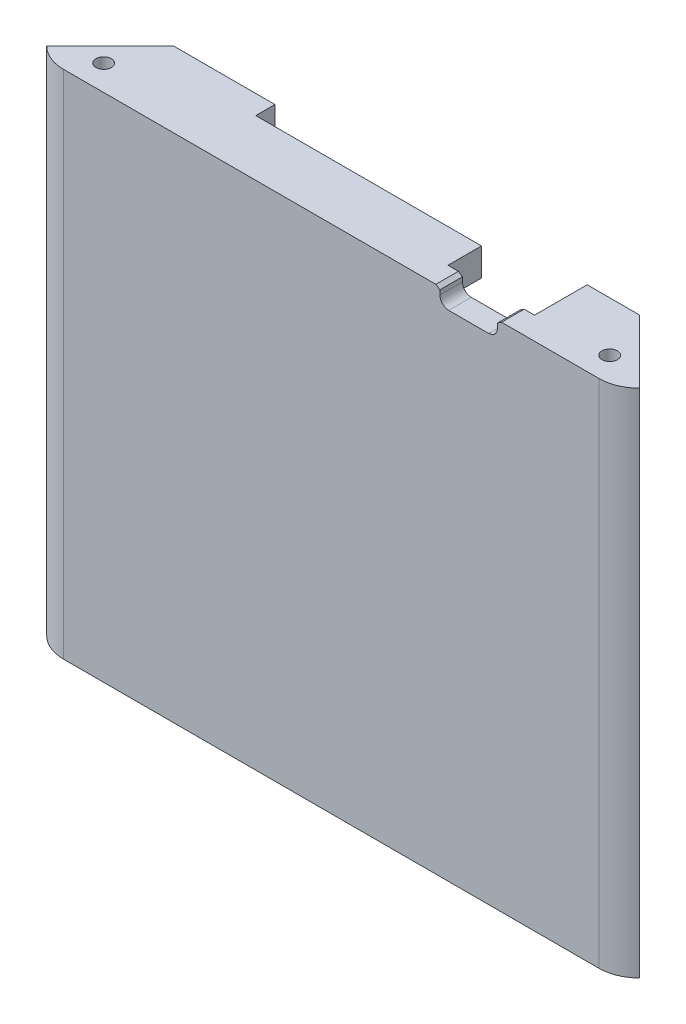
ISO-10303-21;
HEADER;
FILE_DESCRIPTION(('STEP AP214'),'2;1');
FILE_NAME('part.step','',(''),(''),'','','');
FILE_SCHEMA(('AUTOMOTIVE_DESIGN { 1 0 10303 214 1 1 1 1 }'));
ENDSEC;
DATA;
#1=APPLICATION_CONTEXT('core data for automotive mechanical design processes');
#2=APPLICATION_PROTOCOL_DEFINITION('international standard','automotive_design',2000,#1);
#3=PRODUCT_CONTEXT('',#1,'mechanical');
#4=PRODUCT('Part','Part','',(#3));
#5=PRODUCT_RELATED_PRODUCT_CATEGORY('part','',(#4));
#6=PRODUCT_DEFINITION_FORMATION('','',#4);
#7=PRODUCT_DEFINITION_CONTEXT('part definition',#1,'design');
#8=PRODUCT_DEFINITION('design','',#6,#7);
#9=PRODUCT_DEFINITION_SHAPE('','',#8);
#10=(LENGTH_UNIT() NAMED_UNIT(*) SI_UNIT(.MILLI.,.METRE.));
#11=(NAMED_UNIT(*) PLANE_ANGLE_UNIT() SI_UNIT($,.RADIAN.));
#12=(NAMED_UNIT(*) SI_UNIT($,.STERADIAN.) SOLID_ANGLE_UNIT());
#13=UNCERTAINTY_MEASURE_WITH_UNIT(LENGTH_MEASURE(1.E-05),#10,'distance_accuracy_value','');
#14=(GEOMETRIC_REPRESENTATION_CONTEXT(3) GLOBAL_UNCERTAINTY_ASSIGNED_CONTEXT((#13)) GLOBAL_UNIT_ASSIGNED_CONTEXT((#10,
#11,#12)) REPRESENTATION_CONTEXT('',''));
#15=CARTESIAN_POINT('',(0.,0.,0.));
#16=DIRECTION('',(0.,0.,1.));
#17=DIRECTION('',(1.,0.,0.));
#18=AXIS2_PLACEMENT_3D('',#15,#16,#17);
#19=CARTESIAN_POINT('',(-40.95,33.95,-10.));
#20=DIRECTION('',(0.,1.,0.));
#21=DIRECTION('',(0.,0.,1.));
#22=AXIS2_PLACEMENT_3D('',#19,#20,#21);
#23=PLANE('',#22);
#24=DIRECTION('',(0.,0.,-1.));
#25=VECTOR('',#24,1.);
#26=CARTESIAN_POINT('',(13.9111322006649,33.95,-10.001));
#27=LINE('',#26,#25);
#28=CARTESIAN_POINT('',(13.9111322006649,33.95,0.));
#29=VERTEX_POINT('',#28);
#30=CARTESIAN_POINT('',(13.9111322006649,33.95,-3.00218371426969));
#31=VERTEX_POINT('',#30);
#32=EDGE_CURVE('E229',#29,#31,#27,.T.);
#33=ORIENTED_EDGE('',*,*,#32,.T.);
#34=DIRECTION('',(1.,0.,0.));
#35=VECTOR('',#34,1.);
#36=CARTESIAN_POINT('',(24.0221881412254,33.95,-3.0021837142697));
#37=LINE('',#36,#35);
#38=CARTESIAN_POINT('',(12.5221881412254,33.95,-3.00218371426969));
#39=VERTEX_POINT('',#38);
#40=EDGE_CURVE('E367',#39,#31,#37,.T.);
#41=ORIENTED_EDGE('',*,*,#40,.F.);
#42=DIRECTION('',(0.,0.,1.));
#43=VECTOR('',#42,1.);
#44=CARTESIAN_POINT('',(12.5221881412254,33.95,-3.00218371426969));
#45=LINE('',#44,#43);
#46=CARTESIAN_POINT('',(12.5221881412255,33.95,-7.45));
#47=VERTEX_POINT('',#46);
#48=EDGE_CURVE('E364',#47,#39,#45,.T.);
#49=ORIENTED_EDGE('',*,*,#48,.F.);
#50=DIRECTION('',(1.,0.,0.));
#51=VECTOR('',#50,1.);
#52=CARTESIAN_POINT('',(-17.4778118587745,33.95,-7.45));
#53=LINE('',#52,#51);
#54=CARTESIAN_POINT('',(-17.4778118587745,33.95,-7.45));
#55=VERTEX_POINT('',#54);
#56=EDGE_CURVE('E361',#55,#47,#53,.T.);
#57=ORIENTED_EDGE('',*,*,#56,.F.);
#58=DIRECTION('',(0.,0.,1.));
#59=VECTOR('',#58,1.);
#60=CARTESIAN_POINT('',(-17.4778118587745,33.95,-10.));
#61=LINE('',#60,#59);
#62=CARTESIAN_POINT('',(-17.4778118587745,33.95,-10.));
#63=VERTEX_POINT('',#62);
#64=EDGE_CURVE('E340',#63,#55,#61,.T.);
#65=ORIENTED_EDGE('',*,*,#64,.F.);
#66=DIRECTION('',(-1.,0.,0.));
#67=VECTOR('',#66,1.);
#68=CARTESIAN_POINT('',(-40.95,33.95,-10.));
#69=LINE('',#68,#67);
#70=CARTESIAN_POINT('',(-30.95,33.95,-10.));
#71=VERTEX_POINT('',#70);
#72=EDGE_CURVE('E237',#63,#71,#69,.T.);
#73=ORIENTED_EDGE('',*,*,#72,.T.);
#74=DIRECTION('',(-0.707106781186548,0.,0.707106781186548));
#75=VECTOR('',#74,1.);
#76=CARTESIAN_POINT('',(-20.475,33.95,-20.475));
#77=LINE('',#76,#75);
#78=CARTESIAN_POINT('',(-39.3830212793475,33.95,-1.56697872065251));
#79=VERTEX_POINT('',#78);
#80=EDGE_CURVE('E322',#71,#79,#77,.T.);
#81=ORIENTED_EDGE('',*,*,#80,.T.);
#82=CARTESIAN_POINT('',(-35.5999999999992,33.95,-5.34999999999922));
#83=DIRECTION('',(0.,1.,0.));
#84=DIRECTION('',(0.,0.,1.));
#85=AXIS2_PLACEMENT_3D('',#82,#83,#84);
#86=CIRCLE('',#85,5.34999999999921);
#87=CARTESIAN_POINT('',(-35.5999999999992,33.95,0.));
#88=VERTEX_POINT('',#87);
#89=EDGE_CURVE('E292',#88,#79,#86,.F.);
#90=ORIENTED_EDGE('',*,*,#89,.F.);
#91=DIRECTION('',(-1.,0.,0.));
#92=VECTOR('',#91,1.);
#93=CARTESIAN_POINT('',(-40.95,33.95,0.));
#94=LINE('',#93,#92);
#95=EDGE_CURVE('E236',#29,#88,#94,.T.);
#96=ORIENTED_EDGE('',*,*,#95,.F.);
#97=EDGE_LOOP('',(#33,#41,#49,#57,#65,#73,#81,#90,#96));
#98=FACE_BOUND('',#97,.T.);
#99=CARTESIAN_POINT('',(-33.6321067811865,33.95,-3.38210678118655));
#100=DIRECTION('',(0.,1.,0.));
#101=DIRECTION('',(0.,0.,1.));
#102=AXIS2_PLACEMENT_3D('',#99,#100,#101);
#103=CIRCLE('',#102,1.02499999999999);
#104=CARTESIAN_POINT('',(-33.6321067811865,33.95,-2.35710678118655));
#105=VERTEX_POINT('',#104);
#106=EDGE_CURVE('E298',#105,#105,#103,.T.);
#107=ORIENTED_EDGE('',*,*,#106,.F.);
#108=EDGE_LOOP('',(#107));
#109=FACE_BOUND('',#108,.T.);
#110=ADVANCED_FACE('F37',(#98,#109),#23,.T.);
#111=CARTESIAN_POINT('',(-40.95,-33.95,-10.));
#112=DIRECTION('',(0.,-1.,0.));
#113=DIRECTION('',(0.,0.,-1.));
#114=AXIS2_PLACEMENT_3D('',#111,#112,#113);
#115=PLANE('',#114);
#116=DIRECTION('',(0.707106781186548,0.,0.707106781186548));
#117=VECTOR('',#116,1.);
#118=CARTESIAN_POINT('',(20.475,-33.95,-20.475));
#119=LINE('',#118,#117);
#120=CARTESIAN_POINT('',(30.95,-33.95,-10.));
#121=VERTEX_POINT('',#120);
#122=CARTESIAN_POINT('',(39.3830212793475,-33.95,-1.56697872065252));
#123=VERTEX_POINT('',#122);
#124=EDGE_CURVE('E327',#121,#123,#119,.T.);
#125=ORIENTED_EDGE('',*,*,#124,.T.);
#126=CARTESIAN_POINT('',(35.5999999999992,-33.95,-5.34999999999922));
#127=DIRECTION('',(0.,-1.,0.));
#128=DIRECTION('',(0.,0.,1.));
#129=AXIS2_PLACEMENT_3D('',#126,#127,#128);
#130=CIRCLE('',#129,5.34999999999921);
#131=CARTESIAN_POINT('',(35.5999999999992,-33.95,0.));
#132=VERTEX_POINT('',#131);
#133=EDGE_CURVE('E278',#123,#132,#130,.T.);
#134=ORIENTED_EDGE('',*,*,#133,.T.);
#135=DIRECTION('',(1.,0.,0.));
#136=VECTOR('',#135,1.);
#137=CARTESIAN_POINT('',(-40.95,-33.95,0.));
#138=LINE('',#137,#136);
#139=CARTESIAN_POINT('',(-35.5999999999992,-33.95,0.));
#140=VERTEX_POINT('',#139);
#141=EDGE_CURVE('E41',#140,#132,#138,.T.);
#142=ORIENTED_EDGE('',*,*,#141,.F.);
#143=CARTESIAN_POINT('',(-35.5999999999992,-33.95,-5.34999999999922));
#144=DIRECTION('',(0.,-1.,0.));
#145=DIRECTION('',(0.,0.,-1.));
#146=AXIS2_PLACEMENT_3D('',#143,#144,#145);
#147=CIRCLE('',#146,5.34999999999921);
#148=CARTESIAN_POINT('',(-39.3830212793475,-33.95,-1.56697872065252));
#149=VERTEX_POINT('',#148);
#150=EDGE_CURVE('E289',#140,#149,#147,.T.);
#151=ORIENTED_EDGE('',*,*,#150,.T.);
#152=DIRECTION('',(-0.707106781186548,0.,0.707106781186548));
#153=VECTOR('',#152,1.);
#154=CARTESIAN_POINT('',(-20.475,-33.95,-20.475));
#155=LINE('',#154,#153);
#156=CARTESIAN_POINT('',(-30.95,-33.95,-10.));
#157=VERTEX_POINT('',#156);
#158=EDGE_CURVE('E325',#157,#149,#155,.T.);
#159=ORIENTED_EDGE('',*,*,#158,.F.);
#160=DIRECTION('',(1.,0.,0.));
#161=VECTOR('',#160,1.);
#162=CARTESIAN_POINT('',(-40.95,-33.95,-10.));
#163=LINE('',#162,#161);
#164=EDGE_CURVE('E11',#157,#121,#163,.T.);
#165=ORIENTED_EDGE('',*,*,#164,.T.);
#166=EDGE_LOOP('',(#125,#134,#142,#151,#159,#165));
#167=FACE_BOUND('',#166,.T.);
#168=CARTESIAN_POINT('',(33.6321067811865,-33.95,-3.38210678118655));
#169=DIRECTION('',(0.,-1.,0.));
#170=DIRECTION('',(0.,0.,-1.));
#171=AXIS2_PLACEMENT_3D('',#168,#169,#170);
#172=CIRCLE('',#171,1.02499999999999);
#173=CARTESIAN_POINT('',(33.6321067811865,-33.95,-4.40710678118654));
#174=VERTEX_POINT('',#173);
#175=EDGE_CURVE('E316',#174,#174,#172,.T.);
#176=ORIENTED_EDGE('',*,*,#175,.F.);
#177=EDGE_LOOP('',(#176));
#178=FACE_BOUND('',#177,.T.);
#179=CARTESIAN_POINT('',(-33.6321067811865,-33.95,-3.38210678118655));
#180=DIRECTION('',(0.,-1.,0.));
#181=DIRECTION('',(0.,0.,-1.));
#182=AXIS2_PLACEMENT_3D('',#179,#180,#181);
#183=CIRCLE('',#182,1.02499999999999);
#184=CARTESIAN_POINT('',(-33.6321067811865,-33.95,-4.40710678118654));
#185=VERTEX_POINT('',#184);
#186=EDGE_CURVE('E310',#185,#185,#183,.T.);
#187=ORIENTED_EDGE('',*,*,#186,.F.);
#188=EDGE_LOOP('',(#187));
#189=FACE_BOUND('',#188,.T.);
#190=ADVANCED_FACE('F551',(#167,#178,#189),#115,.T.);
#191=DIRECTION('',(0.,0.,1.));
#192=VECTOR('',#191,1.);
#193=CARTESIAN_POINT('',(22.6432270340901,33.95,-10.001));
#194=LINE('',#193,#192);
#195=CARTESIAN_POINT('',(22.6432270340901,33.95,-3.0021837142697));
#196=VERTEX_POINT('',#195);
#197=CARTESIAN_POINT('',(22.64322703409,33.95,0.));
#198=VERTEX_POINT('',#197);
#199=EDGE_CURVE('E54',#196,#198,#194,.T.);
#200=ORIENTED_EDGE('',*,*,#199,.T.);
#201=CARTESIAN_POINT('',(35.5999999999992,33.95,0.));
#202=VERTEX_POINT('',#201);
#203=EDGE_CURVE('E226',#202,#198,#94,.T.);
#204=ORIENTED_EDGE('',*,*,#203,.F.);
#205=CARTESIAN_POINT('',(35.5999999999992,33.95,-5.34999999999922));
#206=DIRECTION('',(0.,1.,0.));
#207=DIRECTION('',(0.,0.,1.));
#208=AXIS2_PLACEMENT_3D('',#205,#206,#207);
#209=CIRCLE('',#208,5.34999999999921);
#210=CARTESIAN_POINT('',(39.3830212793475,33.95,-1.56697872065252));
#211=VERTEX_POINT('',#210);
#212=EDGE_CURVE('E281',#211,#202,#209,.F.);
#213=ORIENTED_EDGE('',*,*,#212,.F.);
#214=DIRECTION('',(0.707106781186548,0.,0.707106781186548));
#215=VECTOR('',#214,1.);
#216=CARTESIAN_POINT('',(20.475,33.95,-20.475));
#217=LINE('',#216,#215);
#218=CARTESIAN_POINT('',(30.95,33.95,-10.));
#219=VERTEX_POINT('',#218);
#220=EDGE_CURVE('E332',#219,#211,#217,.T.);
#221=ORIENTED_EDGE('',*,*,#220,.F.);
#222=CARTESIAN_POINT('',(24.0221881412254,33.95,-10.));
#223=VERTEX_POINT('',#222);
#224=EDGE_CURVE('E46',#219,#223,#69,.T.);
#225=ORIENTED_EDGE('',*,*,#224,.T.);
#226=DIRECTION('',(0.,0.,-1.));
#227=VECTOR('',#226,1.);
#228=CARTESIAN_POINT('',(24.0221881412254,33.95,-3.0021837142697));
#229=LINE('',#228,#227);
#230=CARTESIAN_POINT('',(24.0221881412254,33.95,-3.0021837142697));
#231=VERTEX_POINT('',#230);
#232=EDGE_CURVE('E370',#231,#223,#229,.T.);
#233=ORIENTED_EDGE('',*,*,#232,.F.);
#234=EDGE_CURVE('E228',#196,#231,#37,.T.);
#235=ORIENTED_EDGE('',*,*,#234,.F.);
#236=EDGE_LOOP('',(#200,#204,#213,#221,#225,#233,#235));
#237=FACE_BOUND('',#236,.T.);
#238=CARTESIAN_POINT('',(33.6321067811865,33.95,-3.38210678118655));
#239=DIRECTION('',(0.,1.,0.));
#240=DIRECTION('',(0.,0.,1.));
#241=AXIS2_PLACEMENT_3D('',#238,#239,#240);
#242=CIRCLE('',#241,1.02499999999999);
#243=CARTESIAN_POINT('',(33.6321067811865,33.95,-2.35710678118655));
#244=VERTEX_POINT('',#243);
#245=EDGE_CURVE('E304',#244,#244,#242,.T.);
#246=ORIENTED_EDGE('',*,*,#245,.F.);
#247=EDGE_LOOP('',(#246));
#248=FACE_BOUND('',#247,.T.);
#249=ADVANCED_FACE('F39',(#237,#248),#23,.T.);
#250=CARTESIAN_POINT('',(0.,0.,-10.));
#251=DIRECTION('',(0.,0.,1.));
#252=DIRECTION('',(1.,0.,0.));
#253=AXIS2_PLACEMENT_3D('',#250,#251,#252);
#254=PLANE('',#253);
#255=DIRECTION('',(1.,0.,0.));
#256=VECTOR('',#255,1.);
#257=CARTESIAN_POINT('',(30.25,30.25,-10.));
#258=LINE('',#257,#256);
#259=CARTESIAN_POINT('',(24.0221881412254,30.25,-10.));
#260=VERTEX_POINT('',#259);
#261=CARTESIAN_POINT('',(30.25,30.25,-10.));
#262=VERTEX_POINT('',#261);
#263=EDGE_CURVE('E262',#260,#262,#258,.T.);
#264=ORIENTED_EDGE('',*,*,#263,.F.);
#265=DIRECTION('',(0.,1.,0.));
#266=VECTOR('',#265,1.);
#267=CARTESIAN_POINT('',(24.0221881412254,-33.951,-10.));
#268=LINE('',#267,#266);
#269=EDGE_CURVE('E343',#260,#223,#268,.T.);
#270=ORIENTED_EDGE('',*,*,#269,.T.);
#271=ORIENTED_EDGE('',*,*,#224,.F.);
#272=DIRECTION('',(0.,1.,0.));
#273=VECTOR('',#272,1.);
#274=CARTESIAN_POINT('',(30.95,-33.951,-10.));
#275=LINE('',#274,#273);
#276=EDGE_CURVE('E330',#121,#219,#275,.T.);
#277=ORIENTED_EDGE('',*,*,#276,.F.);
#278=ORIENTED_EDGE('',*,*,#164,.F.);
#279=DIRECTION('',(0.,1.,0.));
#280=VECTOR('',#279,1.);
#281=CARTESIAN_POINT('',(-30.95,-33.951,-10.));
#282=LINE('',#281,#280);
#283=EDGE_CURVE('E319',#157,#71,#282,.T.);
#284=ORIENTED_EDGE('',*,*,#283,.T.);
#285=ORIENTED_EDGE('',*,*,#72,.F.);
#286=DIRECTION('',(0.,1.,0.));
#287=VECTOR('',#286,1.);
#288=CARTESIAN_POINT('',(-17.4778118587745,-33.951,-10.));
#289=LINE('',#288,#287);
#290=CARTESIAN_POINT('',(-17.4778118587745,30.25,-10.));
#291=VERTEX_POINT('',#290);
#292=EDGE_CURVE('E346',#291,#63,#289,.T.);
#293=ORIENTED_EDGE('',*,*,#292,.F.);
#294=CARTESIAN_POINT('',(-30.25,30.25,-10.));
#295=VERTEX_POINT('',#294);
#296=EDGE_CURVE('E259',#295,#291,#258,.T.);
#297=ORIENTED_EDGE('',*,*,#296,.F.);
#298=DIRECTION('',(0.,1.,0.));
#299=VECTOR('',#298,1.);
#300=CARTESIAN_POINT('',(-30.25,30.25,-10.));
#301=LINE('',#300,#299);
#302=CARTESIAN_POINT('',(-30.25,-30.25,-10.));
#303=VERTEX_POINT('',#302);
#304=EDGE_CURVE('E263',#303,#295,#301,.T.);
#305=ORIENTED_EDGE('',*,*,#304,.F.);
#306=DIRECTION('',(-1.,0.,0.));
#307=VECTOR('',#306,1.);
#308=CARTESIAN_POINT('',(30.25,-30.25,-10.));
#309=LINE('',#308,#307);
#310=CARTESIAN_POINT('',(30.25,-30.25,-10.));
#311=VERTEX_POINT('',#310);
#312=EDGE_CURVE('E252',#311,#303,#309,.T.);
#313=ORIENTED_EDGE('',*,*,#312,.F.);
#314=DIRECTION('',(0.,-1.,0.));
#315=VECTOR('',#314,1.);
#316=CARTESIAN_POINT('',(30.25,30.25,-10.));
#317=LINE('',#316,#315);
#318=EDGE_CURVE('E256',#262,#311,#317,.T.);
#319=ORIENTED_EDGE('',*,*,#318,.F.);
#320=EDGE_LOOP('',(#264,#270,#271,#277,#278,#284,#285,#293,#297,#305,#313,#319));
#321=FACE_BOUND('',#320,.T.);
#322=ADVANCED_FACE('F546',(#321),#254,.F.);
#323=CARTESIAN_POINT('',(0.,0.,0.));
#324=DIRECTION('',(0.,0.,1.));
#325=DIRECTION('',(1.,0.,0.));
#326=AXIS2_PLACEMENT_3D('',#323,#324,#325);
#327=PLANE('',#326);
#328=CARTESIAN_POINT('',(13.2167582157759,34.45,0.));
#329=CARTESIAN_POINT('',(13.6235681909257,34.1570670964042,0.));
#330=CARTESIAN_POINT('',(14.0303781660755,33.8641341928084,0.));
#331=CARTESIAN_POINT('',(14.4371881412252,33.5712012892127,0.));
#332=B_SPLINE_CURVE_WITH_KNOTS('',3,(#328,#329,#330,#331),.UNSPECIFIED.,.F.,.F.,(4,4),
(1.29698587705226,5.96864700131702),.UNSPECIFIED.);
#333=CARTESIAN_POINT('',(14.4371881412254,33.5712012892126,0.));
#334=VERTEX_POINT('',#333);
#335=EDGE_CURVE('E415',#29,#334,#332,.T.);
#336=ORIENTED_EDGE('',*,*,#335,.F.);
#337=ORIENTED_EDGE('',*,*,#95,.T.);
#338=DIRECTION('',(0.,-1.,0.));
#339=VECTOR('',#338,1.);
#340=CARTESIAN_POINT('',(-35.5999999999992,33.951,0.));
#341=LINE('',#340,#339);
#342=EDGE_CURVE('E286',#88,#140,#341,.T.);
#343=ORIENTED_EDGE('',*,*,#342,.T.);
#344=ORIENTED_EDGE('',*,*,#141,.T.);
#345=DIRECTION('',(0.,-1.,0.));
#346=VECTOR('',#345,1.);
#347=CARTESIAN_POINT('',(35.5999999999992,33.951,0.));
#348=LINE('',#347,#346);
#349=EDGE_CURVE('E235',#202,#132,#348,.T.);
#350=ORIENTED_EDGE('',*,*,#349,.F.);
#351=ORIENTED_EDGE('',*,*,#203,.T.);
#352=CARTESIAN_POINT('',(22.1071881412253,33.5914938807402,0.));
#353=CARTESIAN_POINT('',(22.5350680247782,33.8776625871601,0.));
#354=CARTESIAN_POINT('',(22.9629479083311,34.1638312935801,0.));
#355=CARTESIAN_POINT('',(23.3908277918839,34.45,0.));
#356=B_SPLINE_CURVE_WITH_KNOTS('',3,(#352,#353,#354,#355),.UNSPECIFIED.,.F.,.F.,(4,4),
(1.33330156859409,6.34381833781792),.UNSPECIFIED.);
#357=CARTESIAN_POINT('',(22.1071881412254,33.5914938807402,0.));
#358=VERTEX_POINT('',#357);
#359=EDGE_CURVE('E211',#358,#198,#356,.T.);
#360=ORIENTED_EDGE('',*,*,#359,.F.);
#361=DIRECTION('',(0.,1.,0.));
#362=VECTOR('',#361,1.);
#363=CARTESIAN_POINT('',(22.1071881412254,32.9765923343466,0.));
#364=LINE('',#363,#362);
#365=CARTESIAN_POINT('',(22.1071881412254,32.9765923343467,0.));
#366=VERTEX_POINT('',#365);
#367=EDGE_CURVE('E219',#366,#358,#364,.T.);
#368=ORIENTED_EDGE('',*,*,#367,.F.);
#369=CARTESIAN_POINT('',(20.9305958068787,31.8000000000001,0.));
#370=CARTESIAN_POINT('',(21.0791383656951,31.8139386872842,0.));
#371=CARTESIAN_POINT('',(21.3725614404613,31.8692092424383,0.));
#372=CARTESIAN_POINT('',(21.7809393331617,32.1262488080637,0.));
#373=CARTESIAN_POINT('',(22.0379788987871,32.5346267007642,0.));
#374=CARTESIAN_POINT('',(22.0932494539412,32.8280497755303,0.));
#375=CARTESIAN_POINT('',(22.1071881412254,32.9765923343467,0.));
#376=B_SPLINE_CURVE_WITH_KNOTS('',3,(#369,#370,#371,#372,#373,#374,#375),.UNSPECIFIED.,.F.,.F.,
(4,1,1,1,4),(-0.0182086916736054,0.240895654163193,0.499999999999992,0.75910434583679,
1.01820869167359),.UNSPECIFIED.);
#377=CARTESIAN_POINT('',(20.9305958068787,31.8,0.));
#378=VERTEX_POINT('',#377);
#379=EDGE_CURVE('E393',#378,#366,#376,.T.);
#380=ORIENTED_EDGE('',*,*,#379,.F.);
#381=DIRECTION('',(1.,0.,0.));
#382=VECTOR('',#381,1.);
#383=CARTESIAN_POINT('',(15.613780475572,31.8,0.));
#384=LINE('',#383,#382);
#385=CARTESIAN_POINT('',(15.6137804755719,31.8000000000001,0.));
#386=VERTEX_POINT('',#385);
#387=EDGE_CURVE('E398',#386,#378,#384,.T.);
#388=ORIENTED_EDGE('',*,*,#387,.F.);
#389=CARTESIAN_POINT('',(14.4371881412252,32.9765923343466,0.));
#390=CARTESIAN_POINT('',(14.4511268285094,32.8280497755303,0.));
#391=CARTESIAN_POINT('',(14.5063973836635,32.5346267007641,0.));
#392=CARTESIAN_POINT('',(14.7634369492889,32.1262488080637,0.));
#393=CARTESIAN_POINT('',(15.1718148419894,31.8692092424383,0.));
#394=CARTESIAN_POINT('',(15.4652379167555,31.8139386872842,0.));
#395=CARTESIAN_POINT('',(15.6137804755719,31.8000000000001,0.));
#396=B_SPLINE_CURVE_WITH_KNOTS('',3,(#389,#390,#391,#392,#393,#394,#395),.UNSPECIFIED.,.F.,.F.,
(4,1,1,1,4),(-0.018208691673584,0.240895654163213,0.50000000000001,0.759104345836808,
1.0182086916736),.UNSPECIFIED.);
#397=CARTESIAN_POINT('',(14.4371881412254,32.9765923343466,0.));
#398=VERTEX_POINT('',#397);
#399=EDGE_CURVE('E404',#398,#386,#396,.T.);
#400=ORIENTED_EDGE('',*,*,#399,.F.);
#401=DIRECTION('',(0.,-1.,0.));
#402=VECTOR('',#401,1.);
#403=CARTESIAN_POINT('',(14.4371881412254,33.5712012892126,0.));
#404=LINE('',#403,#402);
#405=EDGE_CURVE('E409',#334,#398,#404,.T.);
#406=ORIENTED_EDGE('',*,*,#405,.F.);
#407=EDGE_LOOP('',(#336,#337,#343,#344,#350,#351,#360,#368,#380,#388,#400,#406));
#408=FACE_BOUND('',#407,.T.);
#409=ADVANCED_FACE('F233',(#408),#327,.T.);
#410=CARTESIAN_POINT('',(-30.25,30.25,-1.5));
#411=DIRECTION('',(-1.,0.,0.));
#412=DIRECTION('',(0.,-1.,0.));
#413=AXIS2_PLACEMENT_3D('',#410,#411,#412);
#414=PLANE('',#413);
#415=ORIENTED_EDGE('',*,*,#304,.T.);
#416=DIRECTION('',(0.,0.,-1.));
#417=VECTOR('',#416,1.);
#418=CARTESIAN_POINT('',(-30.25,30.25,-1.5));
#419=LINE('',#418,#417);
#420=CARTESIAN_POINT('',(-30.25,30.25,-1.5));
#421=VERTEX_POINT('',#420);
#422=EDGE_CURVE('E242',#421,#295,#419,.T.);
#423=ORIENTED_EDGE('',*,*,#422,.F.);
#424=DIRECTION('',(0.,1.,0.));
#425=VECTOR('',#424,1.);
#426=CARTESIAN_POINT('',(-30.25,30.25,-1.5));
#427=LINE('',#426,#425);
#428=CARTESIAN_POINT('',(-30.25,-30.25,-1.5));
#429=VERTEX_POINT('',#428);
#430=EDGE_CURVE('E255',#429,#421,#427,.T.);
#431=ORIENTED_EDGE('',*,*,#430,.F.);
#432=DIRECTION('',(0.,0.,-1.));
#433=VECTOR('',#432,1.);
#434=CARTESIAN_POINT('',(-30.25,-30.25,-1.5));
#435=LINE('',#434,#433);
#436=EDGE_CURVE('E238',#429,#303,#435,.T.);
#437=ORIENTED_EDGE('',*,*,#436,.T.);
#438=EDGE_LOOP('',(#415,#423,#431,#437));
#439=FACE_BOUND('',#438,.T.);
#440=ADVANCED_FACE('F535',(#439),#414,.F.);
#441=CARTESIAN_POINT('',(30.25,-30.25,-1.5));
#442=DIRECTION('',(0.,-1.,0.));
#443=DIRECTION('',(0.,0.,-1.));
#444=AXIS2_PLACEMENT_3D('',#441,#442,#443);
#445=PLANE('',#444);
#446=ORIENTED_EDGE('',*,*,#312,.T.);
#447=ORIENTED_EDGE('',*,*,#436,.F.);
#448=DIRECTION('',(-1.,0.,0.));
#449=VECTOR('',#448,1.);
#450=CARTESIAN_POINT('',(30.25,-30.25,-1.5));
#451=LINE('',#450,#449);
#452=CARTESIAN_POINT('',(30.25,-30.25,-1.5));
#453=VERTEX_POINT('',#452);
#454=EDGE_CURVE('E246',#453,#429,#451,.T.);
#455=ORIENTED_EDGE('',*,*,#454,.F.);
#456=DIRECTION('',(0.,0.,-1.));
#457=VECTOR('',#456,1.);
#458=CARTESIAN_POINT('',(30.25,-30.25,-1.5));
#459=LINE('',#458,#457);
#460=EDGE_CURVE('E249',#453,#311,#459,.T.);
#461=ORIENTED_EDGE('',*,*,#460,.T.);
#462=EDGE_LOOP('',(#446,#447,#455,#461));
#463=FACE_BOUND('',#462,.T.);
#464=ADVANCED_FACE('F531',(#463),#445,.F.);
#465=CARTESIAN_POINT('',(30.25,30.25,-1.5));
#466=DIRECTION('',(1.,0.,0.));
#467=DIRECTION('',(0.,1.,0.));
#468=AXIS2_PLACEMENT_3D('',#465,#466,#467);
#469=PLANE('',#468);
#470=ORIENTED_EDGE('',*,*,#318,.T.);
#471=ORIENTED_EDGE('',*,*,#460,.F.);
#472=DIRECTION('',(0.,-1.,0.));
#473=VECTOR('',#472,1.);
#474=CARTESIAN_POINT('',(30.25,30.25,-1.5));
#475=LINE('',#474,#473);
#476=CARTESIAN_POINT('',(30.25,30.25,-1.5));
#477=VERTEX_POINT('',#476);
#478=EDGE_CURVE('E267',#477,#453,#475,.T.);
#479=ORIENTED_EDGE('',*,*,#478,.F.);
#480=DIRECTION('',(0.,0.,-1.));
#481=VECTOR('',#480,1.);
#482=CARTESIAN_POINT('',(30.25,30.25,-1.5));
#483=LINE('',#482,#481);
#484=EDGE_CURVE('E245',#477,#262,#483,.T.);
#485=ORIENTED_EDGE('',*,*,#484,.T.);
#486=EDGE_LOOP('',(#470,#471,#479,#485));
#487=FACE_BOUND('',#486,.T.);
#488=ADVANCED_FACE('F534',(#487),#469,.F.);
#489=CARTESIAN_POINT('',(30.25,30.25,-1.5));
#490=DIRECTION('',(0.,1.,0.));
#491=DIRECTION('',(0.,0.,1.));
#492=AXIS2_PLACEMENT_3D('',#489,#490,#491);
#493=PLANE('',#492);
#494=DIRECTION('',(-1.,0.,0.));
#495=VECTOR('',#494,1.);
#496=CARTESIAN_POINT('',(24.0221881412254,30.25,-3.0021837142697));
#497=LINE('',#496,#495);
#498=CARTESIAN_POINT('',(24.0221881412254,30.25,-3.0021837142697));
#499=VERTEX_POINT('',#498);
#500=CARTESIAN_POINT('',(12.5221881412254,30.25,-3.00218371426969));
#501=VERTEX_POINT('',#500);
#502=EDGE_CURVE('E349',#499,#501,#497,.T.);
#503=ORIENTED_EDGE('',*,*,#502,.F.);
#504=DIRECTION('',(0.,0.,1.));
#505=VECTOR('',#504,1.);
#506=CARTESIAN_POINT('',(24.0221881412254,30.25,-3.0021837142697));
#507=LINE('',#506,#505);
#508=EDGE_CURVE('E352',#260,#499,#507,.T.);
#509=ORIENTED_EDGE('',*,*,#508,.F.);
#510=ORIENTED_EDGE('',*,*,#263,.T.);
#511=ORIENTED_EDGE('',*,*,#484,.F.);
#512=DIRECTION('',(1.,0.,0.));
#513=VECTOR('',#512,1.);
#514=CARTESIAN_POINT('',(30.25,30.25,-1.5));
#515=LINE('',#514,#513);
#516=EDGE_CURVE('E270',#421,#477,#515,.T.);
#517=ORIENTED_EDGE('',*,*,#516,.F.);
#518=ORIENTED_EDGE('',*,*,#422,.T.);
#519=ORIENTED_EDGE('',*,*,#296,.T.);
#520=DIRECTION('',(0.,0.,-1.));
#521=VECTOR('',#520,1.);
#522=CARTESIAN_POINT('',(-17.4778118587745,30.25,-10.));
#523=LINE('',#522,#521);
#524=CARTESIAN_POINT('',(-17.4778118587745,30.25,-7.45));
#525=VERTEX_POINT('',#524);
#526=EDGE_CURVE('E355',#525,#291,#523,.T.);
#527=ORIENTED_EDGE('',*,*,#526,.F.);
#528=DIRECTION('',(-1.,0.,0.));
#529=VECTOR('',#528,1.);
#530=CARTESIAN_POINT('',(-17.4778118587745,30.25,-7.45));
#531=LINE('',#530,#529);
#532=CARTESIAN_POINT('',(12.5221881412255,30.25,-7.45));
#533=VERTEX_POINT('',#532);
#534=EDGE_CURVE('E356',#533,#525,#531,.T.);
#535=ORIENTED_EDGE('',*,*,#534,.F.);
#536=DIRECTION('',(0.,0.,-1.));
#537=VECTOR('',#536,1.);
#538=CARTESIAN_POINT('',(12.5221881412254,30.25,-3.00218371426969));
#539=LINE('',#538,#537);
#540=EDGE_CURVE('E62',#501,#533,#539,.T.);
#541=ORIENTED_EDGE('',*,*,#540,.F.);
#542=EDGE_LOOP('',(#503,#509,#510,#511,#517,#518,#519,#527,#535,#541));
#543=FACE_BOUND('',#542,.T.);
#544=ADVANCED_FACE('F529',(#543),#493,.F.);
#545=CARTESIAN_POINT('',(0.,0.,-1.5));
#546=DIRECTION('',(0.,0.,-1.));
#547=DIRECTION('',(-1.,0.,0.));
#548=AXIS2_PLACEMENT_3D('',#545,#546,#547);
#549=PLANE('',#548);
#550=ORIENTED_EDGE('',*,*,#430,.T.);
#551=ORIENTED_EDGE('',*,*,#516,.T.);
#552=ORIENTED_EDGE('',*,*,#478,.T.);
#553=ORIENTED_EDGE('',*,*,#454,.T.);
#554=EDGE_LOOP('',(#550,#551,#552,#553));
#555=FACE_BOUND('',#554,.T.);
#556=ADVANCED_FACE('F525',(#555),#549,.T.);
#557=CARTESIAN_POINT('',(35.5999999999992,33.951,-5.34999999999922));
#558=DIRECTION('',(0.,-1.,0.));
#559=DIRECTION('',(0.,0.,-1.));
#560=AXIS2_PLACEMENT_3D('',#557,#558,#559);
#561=CYLINDRICAL_SURFACE('',#560,5.34999999999921);
#562=ORIENTED_EDGE('',*,*,#212,.T.);
#563=ORIENTED_EDGE('',*,*,#349,.T.);
#564=ORIENTED_EDGE('',*,*,#133,.F.);
#565=DIRECTION('',(0.,-1.,0.));
#566=VECTOR('',#565,1.);
#567=CARTESIAN_POINT('',(39.3830212793475,33.951,-1.56697872065252));
#568=LINE('',#567,#566);
#569=EDGE_CURVE('E276',#211,#123,#568,.T.);
#570=ORIENTED_EDGE('',*,*,#569,.F.);
#571=EDGE_LOOP('',(#562,#563,#564,#570));
#572=FACE_BOUND('',#571,.T.);
#573=ADVANCED_FACE('F521',(#572),#561,.T.);
#574=CARTESIAN_POINT('',(-35.5999999999992,33.951,-5.34999999999922));
#575=DIRECTION('',(0.,-1.,0.));
#576=DIRECTION('',(0.,0.,-1.));
#577=AXIS2_PLACEMENT_3D('',#574,#575,#576);
#578=CYLINDRICAL_SURFACE('',#577,5.34999999999921);
#579=ORIENTED_EDGE('',*,*,#89,.T.);
#580=DIRECTION('',(0.,-1.,0.));
#581=VECTOR('',#580,1.);
#582=CARTESIAN_POINT('',(-39.3830212793475,33.951,-1.56697872065252));
#583=LINE('',#582,#581);
#584=EDGE_CURVE('E283',#79,#149,#583,.T.);
#585=ORIENTED_EDGE('',*,*,#584,.T.);
#586=ORIENTED_EDGE('',*,*,#150,.F.);
#587=ORIENTED_EDGE('',*,*,#342,.F.);
#588=EDGE_LOOP('',(#579,#585,#586,#587));
#589=FACE_BOUND('',#588,.T.);
#590=ADVANCED_FACE('F517',(#589),#578,.T.);
#591=CARTESIAN_POINT('',(-33.6321067811865,28.95,-3.38210678118655));
#592=DIRECTION('',(0.,1.,0.));
#593=DIRECTION('',(0.,0.,1.));
#594=AXIS2_PLACEMENT_3D('',#591,#592,#593);
#595=CONICAL_SURFACE('',#594,1.025,1.02974425867665);
#596=CARTESIAN_POINT('',(-33.6321067811865,28.3341178654968,-3.38210678118655));
#597=VERTEX_POINT('',#596);
#598=VERTEX_LOOP('',#597);
#599=FACE_BOUND('',#598,.T.);
#600=CARTESIAN_POINT('',(-33.6321067811865,28.95,-3.38210678118655));
#601=DIRECTION('',(0.,1.,0.));
#602=DIRECTION('',(0.,0.,1.));
#603=AXIS2_PLACEMENT_3D('',#600,#601,#602);
#604=CIRCLE('',#603,1.025);
#605=CARTESIAN_POINT('',(-33.6321067811865,28.95,-2.35710678118655));
#606=VERTEX_POINT('',#605);
#607=EDGE_CURVE('E295',#606,#606,#604,.T.);
#608=ORIENTED_EDGE('',*,*,#607,.T.);
#609=EDGE_LOOP('',(#608));
#610=FACE_BOUND('',#609,.T.);
#611=ADVANCED_FACE('F513',(#599,#610),#595,.F.);
#612=CARTESIAN_POINT('',(-33.6321067811865,33.95,-3.38210678118655));
#613=DIRECTION('',(0.,1.,0.));
#614=DIRECTION('',(0.,0.,1.));
#615=AXIS2_PLACEMENT_3D('',#612,#613,#614);
#616=CYLINDRICAL_SURFACE('',#615,1.02499999999999);
#617=ORIENTED_EDGE('',*,*,#607,.F.);
#618=EDGE_LOOP('',(#617));
#619=FACE_BOUND('',#618,.T.);
#620=ORIENTED_EDGE('',*,*,#106,.T.);
#621=EDGE_LOOP('',(#620));
#622=FACE_BOUND('',#621,.T.);
#623=ADVANCED_FACE('F509',(#619,#622),#616,.F.);
#624=CARTESIAN_POINT('',(33.6321067811865,28.95,-3.38210678118655));
#625=DIRECTION('',(0.,1.,0.));
#626=DIRECTION('',(0.,0.,1.));
#627=AXIS2_PLACEMENT_3D('',#624,#625,#626);
#628=CONICAL_SURFACE('',#627,1.025,1.02974425867665);
#629=CARTESIAN_POINT('',(33.6321067811865,28.3341178654968,-3.38210678118655));
#630=VERTEX_POINT('',#629);
#631=VERTEX_LOOP('',#630);
#632=FACE_BOUND('',#631,.T.);
#633=CARTESIAN_POINT('',(33.6321067811865,28.95,-3.38210678118655));
#634=DIRECTION('',(0.,1.,0.));
#635=DIRECTION('',(0.,0.,1.));
#636=AXIS2_PLACEMENT_3D('',#633,#634,#635);
#637=CIRCLE('',#636,1.025);
#638=CARTESIAN_POINT('',(33.6321067811865,28.95,-2.35710678118655));
#639=VERTEX_POINT('',#638);
#640=EDGE_CURVE('E301',#639,#639,#637,.T.);
#641=ORIENTED_EDGE('',*,*,#640,.T.);
#642=EDGE_LOOP('',(#641));
#643=FACE_BOUND('',#642,.T.);
#644=ADVANCED_FACE('F505',(#632,#643),#628,.F.);
#645=CARTESIAN_POINT('',(33.6321067811865,33.95,-3.38210678118655));
#646=DIRECTION('',(0.,1.,0.));
#647=DIRECTION('',(0.,0.,1.));
#648=AXIS2_PLACEMENT_3D('',#645,#646,#647);
#649=CYLINDRICAL_SURFACE('',#648,1.02499999999999);
#650=ORIENTED_EDGE('',*,*,#640,.F.);
#651=EDGE_LOOP('',(#650));
#652=FACE_BOUND('',#651,.T.);
#653=ORIENTED_EDGE('',*,*,#245,.T.);
#654=EDGE_LOOP('',(#653));
#655=FACE_BOUND('',#654,.T.);
#656=ADVANCED_FACE('F501',(#652,#655),#649,.F.);
#657=CARTESIAN_POINT('',(-33.6321067811865,-28.95,-3.38210678118655));
#658=DIRECTION('',(0.,-1.,0.));
#659=DIRECTION('',(0.,0.,-1.));
#660=AXIS2_PLACEMENT_3D('',#657,#658,#659);
#661=CONICAL_SURFACE('',#660,1.025,1.02974425867665);
#662=CARTESIAN_POINT('',(-33.6321067811865,-28.3341178654968,-3.38210678118655));
#663=VERTEX_POINT('',#662);
#664=VERTEX_LOOP('',#663);
#665=FACE_BOUND('',#664,.T.);
#666=CARTESIAN_POINT('',(-33.6321067811865,-28.95,-3.38210678118655));
#667=DIRECTION('',(0.,-1.,0.));
#668=DIRECTION('',(0.,0.,-1.));
#669=AXIS2_PLACEMENT_3D('',#666,#667,#668);
#670=CIRCLE('',#669,1.025);
#671=CARTESIAN_POINT('',(-33.6321067811865,-28.95,-4.40710678118654));
#672=VERTEX_POINT('',#671);
#673=EDGE_CURVE('E307',#672,#672,#670,.T.);
#674=ORIENTED_EDGE('',*,*,#673,.T.);
#675=EDGE_LOOP('',(#674));
#676=FACE_BOUND('',#675,.T.);
#677=ADVANCED_FACE('F497',(#665,#676),#661,.F.);
#678=CARTESIAN_POINT('',(-33.6321067811865,-33.95,-3.38210678118655));
#679=DIRECTION('',(0.,-1.,0.));
#680=DIRECTION('',(0.,0.,-1.));
#681=AXIS2_PLACEMENT_3D('',#678,#679,#680);
#682=CYLINDRICAL_SURFACE('',#681,1.02499999999999);
#683=ORIENTED_EDGE('',*,*,#673,.F.);
#684=EDGE_LOOP('',(#683));
#685=FACE_BOUND('',#684,.T.);
#686=ORIENTED_EDGE('',*,*,#186,.T.);
#687=EDGE_LOOP('',(#686));
#688=FACE_BOUND('',#687,.T.);
#689=ADVANCED_FACE('F493',(#685,#688),#682,.F.);
#690=CARTESIAN_POINT('',(33.6321067811865,-28.95,-3.38210678118655));
#691=DIRECTION('',(0.,-1.,0.));
#692=DIRECTION('',(0.,0.,-1.));
#693=AXIS2_PLACEMENT_3D('',#690,#691,#692);
#694=CONICAL_SURFACE('',#693,1.025,1.02974425867665);
#695=CARTESIAN_POINT('',(33.6321067811865,-28.3341178654968,-3.38210678118655));
#696=VERTEX_POINT('',#695);
#697=VERTEX_LOOP('',#696);
#698=FACE_BOUND('',#697,.T.);
#699=CARTESIAN_POINT('',(33.6321067811865,-28.95,-3.38210678118655));
#700=DIRECTION('',(0.,-1.,0.));
#701=DIRECTION('',(0.,0.,-1.));
#702=AXIS2_PLACEMENT_3D('',#699,#700,#701);
#703=CIRCLE('',#702,1.025);
#704=CARTESIAN_POINT('',(33.6321067811865,-28.95,-4.40710678118654));
#705=VERTEX_POINT('',#704);
#706=EDGE_CURVE('E313',#705,#705,#703,.T.);
#707=ORIENTED_EDGE('',*,*,#706,.T.);
#708=EDGE_LOOP('',(#707));
#709=FACE_BOUND('',#708,.T.);
#710=ADVANCED_FACE('F489',(#698,#709),#694,.F.);
#711=CARTESIAN_POINT('',(33.6321067811865,-33.95,-3.38210678118655));
#712=DIRECTION('',(0.,-1.,0.));
#713=DIRECTION('',(0.,0.,-1.));
#714=AXIS2_PLACEMENT_3D('',#711,#712,#713);
#715=CYLINDRICAL_SURFACE('',#714,1.02499999999999);
#716=ORIENTED_EDGE('',*,*,#706,.F.);
#717=EDGE_LOOP('',(#716));
#718=FACE_BOUND('',#717,.T.);
#719=ORIENTED_EDGE('',*,*,#175,.T.);
#720=EDGE_LOOP('',(#719));
#721=FACE_BOUND('',#720,.T.);
#722=ADVANCED_FACE('F485',(#718,#721),#715,.F.);
#723=CARTESIAN_POINT('',(-20.475,-33.951,-20.475));
#724=DIRECTION('',(-0.707106781186548,0.,-0.707106781186548));
#725=DIRECTION('',(-0.707106781186548,0.,0.707106781186548));
#726=AXIS2_PLACEMENT_3D('',#723,#724,#725);
#727=PLANE('',#726);
#728=ORIENTED_EDGE('',*,*,#158,.T.);
#729=ORIENTED_EDGE('',*,*,#584,.F.);
#730=ORIENTED_EDGE('',*,*,#80,.F.);
#731=ORIENTED_EDGE('',*,*,#283,.F.);
#732=EDGE_LOOP('',(#728,#729,#730,#731));
#733=FACE_BOUND('',#732,.T.);
#734=ADVANCED_FACE('F481',(#733),#727,.T.);
#735=CARTESIAN_POINT('',(20.475,-33.951,-20.475));
#736=DIRECTION('',(-0.707106781186548,0.,0.707106781186548));
#737=DIRECTION('',(0.707106781186548,0.,0.707106781186548));
#738=AXIS2_PLACEMENT_3D('',#735,#736,#737);
#739=PLANE('',#738);
#740=ORIENTED_EDGE('',*,*,#276,.T.);
#741=ORIENTED_EDGE('',*,*,#220,.T.);
#742=ORIENTED_EDGE('',*,*,#569,.T.);
#743=ORIENTED_EDGE('',*,*,#124,.F.);
#744=EDGE_LOOP('',(#740,#741,#742,#743));
#745=FACE_BOUND('',#744,.T.);
#746=ADVANCED_FACE('F478',(#745),#739,.F.);
#747=CARTESIAN_POINT('',(12.5221881412254,-33.951,-3.00218371426969));
#748=DIRECTION('',(-1.,0.,0.));
#749=DIRECTION('',(0.,0.,1.));
#750=AXIS2_PLACEMENT_3D('',#747,#748,#749);
#751=PLANE('',#750);
#752=ORIENTED_EDGE('',*,*,#540,.T.);
#753=DIRECTION('',(0.,1.,0.));
#754=VECTOR('',#753,1.);
#755=CARTESIAN_POINT('',(12.5221881412255,-33.951,-7.45));
#756=LINE('',#755,#754);
#757=EDGE_CURVE('E334',#533,#47,#756,.T.);
#758=ORIENTED_EDGE('',*,*,#757,.T.);
#759=ORIENTED_EDGE('',*,*,#48,.T.);
#760=DIRECTION('',(0.,1.,0.));
#761=VECTOR('',#760,1.);
#762=CARTESIAN_POINT('',(12.5221881412254,-33.951,-3.00218371426969));
#763=LINE('',#762,#761);
#764=EDGE_CURVE('E337',#501,#39,#763,.T.);
#765=ORIENTED_EDGE('',*,*,#764,.F.);
#766=EDGE_LOOP('',(#752,#758,#759,#765));
#767=FACE_BOUND('',#766,.T.);
#768=ADVANCED_FACE('F474',(#767),#751,.F.);
#769=CARTESIAN_POINT('',(24.0221881412254,-33.951,-3.0021837142697));
#770=DIRECTION('',(0.,0.,1.));
#771=DIRECTION('',(1.,0.,0.));
#772=AXIS2_PLACEMENT_3D('',#769,#770,#771);
#773=PLANE('',#772);
#774=ORIENTED_EDGE('',*,*,#40,.T.);
#775=DIRECTION('',(-0.81150622687001,0.584343771893908,0.));
#776=VECTOR('',#775,1.);
#777=CARTESIAN_POINT('',(13.2167582157759,34.45,-3.00218371426969));
#778=LINE('',#777,#776);
#779=CARTESIAN_POINT('',(14.4371881412254,33.5712012892126,-3.00218371426969));
#780=VERTEX_POINT('',#779);
#781=EDGE_CURVE('E420',#780,#31,#778,.T.);
#782=ORIENTED_EDGE('',*,*,#781,.F.);
#783=DIRECTION('',(0.,1.,0.));
#784=VECTOR('',#783,1.);
#785=CARTESIAN_POINT('',(14.4371881412254,33.5712012892126,-3.00218371426969));
#786=LINE('',#785,#784);
#787=CARTESIAN_POINT('',(14.4371881412254,32.9765923343466,-3.00218371426969));
#788=VERTEX_POINT('',#787);
#789=EDGE_CURVE('E359',#788,#780,#786,.T.);
#790=ORIENTED_EDGE('',*,*,#789,.F.);
#791=CARTESIAN_POINT('',(14.4371881412252,32.9765923343466,-3.00218371426969));
#792=CARTESIAN_POINT('',(14.4511268285094,32.8280497755303,-3.00218371426969));
#793=CARTESIAN_POINT('',(14.5063973836635,32.5346267007641,-3.00218371426969));
#794=CARTESIAN_POINT('',(14.7634369492889,32.1262488080637,-3.00218371426969));
#795=CARTESIAN_POINT('',(15.1718148419894,31.8692092424383,-3.00218371426969));
#796=CARTESIAN_POINT('',(15.4652379167555,31.8139386872842,-3.00218371426969));
#797=CARTESIAN_POINT('',(15.6137804755719,31.8000000000001,-3.00218371426969));
#798=B_SPLINE_CURVE_WITH_KNOTS('',3,(#791,#792,#793,#794,#795,#796,#797),.UNSPECIFIED.,.F.,.F.,
(4,1,1,1,4),(-0.018208691673584,0.240895654163213,0.50000000000001,0.759104345836808,
1.0182086916736),.UNSPECIFIED.);
#799=CARTESIAN_POINT('',(15.6137804755719,31.8000000000001,-3.00218371426969));
#800=VERTEX_POINT('',#799);
#801=EDGE_CURVE('E598',#800,#788,#798,.F.);
#802=ORIENTED_EDGE('',*,*,#801,.F.);
#803=DIRECTION('',(-1.,0.,0.));
#804=VECTOR('',#803,1.);
#805=CARTESIAN_POINT('',(15.613780475572,31.8,-3.00218371426969));
#806=LINE('',#805,#804);
#807=CARTESIAN_POINT('',(20.9305958068787,31.8,-3.00218371426969));
#808=VERTEX_POINT('',#807);
#809=EDGE_CURVE('E592',#808,#800,#806,.T.);
#810=ORIENTED_EDGE('',*,*,#809,.F.);
#811=CARTESIAN_POINT('',(20.9305958068787,31.8000000000001,-3.0021837142697));
#812=CARTESIAN_POINT('',(21.0791383656951,31.8139386872842,-3.0021837142697));
#813=CARTESIAN_POINT('',(21.3725614404613,31.8692092424383,-3.0021837142697));
#814=CARTESIAN_POINT('',(21.7809393331617,32.1262488080637,-3.0021837142697));
#815=CARTESIAN_POINT('',(22.0379788987871,32.5346267007642,-3.0021837142697));
#816=CARTESIAN_POINT('',(22.0932494539412,32.8280497755303,-3.0021837142697));
#817=CARTESIAN_POINT('',(22.1071881412254,32.9765923343467,-3.0021837142697));
#818=B_SPLINE_CURVE_WITH_KNOTS('',3,(#811,#812,#813,#814,#815,#816,#817),.UNSPECIFIED.,.F.,.F.,
(4,1,1,1,4),(-0.0182086916736054,0.240895654163193,0.499999999999992,0.75910434583679,
1.01820869167359),.UNSPECIFIED.);
#819=CARTESIAN_POINT('',(22.1071881412254,32.9765923343467,-3.0021837142697));
#820=VERTEX_POINT('',#819);
#821=EDGE_CURVE('E585',#820,#808,#818,.F.);
#822=ORIENTED_EDGE('',*,*,#821,.F.);
#823=DIRECTION('',(0.,-1.,0.));
#824=VECTOR('',#823,1.);
#825=CARTESIAN_POINT('',(22.1071881412254,32.9765923343466,-3.0021837142697));
#826=LINE('',#825,#824);
#827=CARTESIAN_POINT('',(22.1071881412254,33.5914938807402,-3.0021837142697));
#828=VERTEX_POINT('',#827);
#829=EDGE_CURVE('E583',#828,#820,#826,.T.);
#830=ORIENTED_EDGE('',*,*,#829,.F.);
#831=DIRECTION('',(-0.831228575626767,-0.555930800605162,0.));
#832=VECTOR('',#831,1.);
#833=CARTESIAN_POINT('',(22.1071881412253,33.5914938807402,-3.0021837142697));
#834=LINE('',#833,#832);
#835=EDGE_CURVE('E580',#196,#828,#834,.T.);
#836=ORIENTED_EDGE('',*,*,#835,.F.);
#837=ORIENTED_EDGE('',*,*,#234,.T.);
#838=DIRECTION('',(0.,1.,0.));
#839=VECTOR('',#838,1.);
#840=CARTESIAN_POINT('',(24.0221881412254,-33.951,-3.0021837142697));
#841=LINE('',#840,#839);
#842=EDGE_CURVE('E339',#499,#231,#841,.T.);
#843=ORIENTED_EDGE('',*,*,#842,.F.);
#844=ORIENTED_EDGE('',*,*,#502,.T.);
#845=ORIENTED_EDGE('',*,*,#764,.T.);
#846=EDGE_LOOP('',(#774,#782,#790,#802,#810,#822,#830,#836,#837,#843,#844,#845));
#847=FACE_BOUND('',#846,.T.);
#848=ADVANCED_FACE('F470',(#847),#773,.F.);
#849=CARTESIAN_POINT('',(24.0221881412254,-33.951,-3.0021837142697));
#850=DIRECTION('',(1.,0.,0.));
#851=DIRECTION('',(0.,0.,-1.));
#852=AXIS2_PLACEMENT_3D('',#849,#850,#851);
#853=PLANE('',#852);
#854=ORIENTED_EDGE('',*,*,#508,.T.);
#855=ORIENTED_EDGE('',*,*,#842,.T.);
#856=ORIENTED_EDGE('',*,*,#232,.T.);
#857=ORIENTED_EDGE('',*,*,#269,.F.);
#858=EDGE_LOOP('',(#854,#855,#856,#857));
#859=FACE_BOUND('',#858,.T.);
#860=ADVANCED_FACE('F466',(#859),#853,.F.);
#861=CARTESIAN_POINT('',(-17.4778118587745,-33.951,-10.));
#862=DIRECTION('',(-1.,0.,0.));
#863=DIRECTION('',(0.,0.,1.));
#864=AXIS2_PLACEMENT_3D('',#861,#862,#863);
#865=PLANE('',#864);
#866=ORIENTED_EDGE('',*,*,#526,.T.);
#867=ORIENTED_EDGE('',*,*,#292,.T.);
#868=ORIENTED_EDGE('',*,*,#64,.T.);
#869=DIRECTION('',(0.,1.,0.));
#870=VECTOR('',#869,1.);
#871=CARTESIAN_POINT('',(-17.4778118587745,-33.951,-7.45));
#872=LINE('',#871,#870);
#873=EDGE_CURVE('E336',#525,#55,#872,.T.);
#874=ORIENTED_EDGE('',*,*,#873,.F.);
#875=EDGE_LOOP('',(#866,#867,#868,#874));
#876=FACE_BOUND('',#875,.T.);
#877=ADVANCED_FACE('F462',(#876),#865,.F.);
#878=CARTESIAN_POINT('',(-17.4778118587745,-33.951,-7.45));
#879=DIRECTION('',(0.,0.,1.));
#880=DIRECTION('',(1.,0.,0.));
#881=AXIS2_PLACEMENT_3D('',#878,#879,#880);
#882=PLANE('',#881);
#883=ORIENTED_EDGE('',*,*,#534,.T.);
#884=ORIENTED_EDGE('',*,*,#873,.T.);
#885=ORIENTED_EDGE('',*,*,#56,.T.);
#886=ORIENTED_EDGE('',*,*,#757,.F.);
#887=EDGE_LOOP('',(#883,#884,#885,#886));
#888=FACE_BOUND('',#887,.T.);
#889=ADVANCED_FACE('F459',(#888),#882,.F.);
#890=CARTESIAN_POINT('',(22.1071881412254,32.9765923343466,-10.001));
#891=DIRECTION('',(1.,0.,0.));
#892=DIRECTION('',(0.,0.,-1.));
#893=AXIS2_PLACEMENT_3D('',#890,#891,#892);
#894=PLANE('',#893);
#895=ORIENTED_EDGE('',*,*,#829,.T.);
#896=DIRECTION('',(0.,0.,1.));
#897=VECTOR('',#896,1.);
#898=CARTESIAN_POINT('',(22.1071881412254,32.9765923343467,-10.001));
#899=LINE('',#898,#897);
#900=EDGE_CURVE('E384',#820,#366,#899,.T.);
#901=ORIENTED_EDGE('',*,*,#900,.T.);
#902=ORIENTED_EDGE('',*,*,#367,.T.);
#903=DIRECTION('',(0.,0.,1.));
#904=VECTOR('',#903,1.);
#905=CARTESIAN_POINT('',(22.1071881412254,33.5914938807402,-10.001));
#906=LINE('',#905,#904);
#907=EDGE_CURVE('E213',#828,#358,#906,.T.);
#908=ORIENTED_EDGE('',*,*,#907,.F.);
#909=EDGE_LOOP('',(#895,#901,#902,#908));
#910=FACE_BOUND('',#909,.T.);
#911=ADVANCED_FACE('F441',(#910),#894,.F.);
#912=CARTESIAN_POINT('',(20.9305958068787,31.8000000000001,-10.001));
#913=CARTESIAN_POINT('',(21.0791383656951,31.8139386872842,-10.001));
#914=CARTESIAN_POINT('',(21.3725614404613,31.8692092424383,-10.001));
#915=CARTESIAN_POINT('',(21.7809393331617,32.1262488080637,-10.001));
#916=CARTESIAN_POINT('',(22.0379788987871,32.5346267007642,-10.001));
#917=CARTESIAN_POINT('',(22.0932494539412,32.8280497755303,-10.001));
#918=CARTESIAN_POINT('',(22.1071881412254,32.9765923343467,-10.001));
#919=B_SPLINE_CURVE_WITH_KNOTS('',3,(#912,#913,#914,#915,#916,#917,#918),.UNSPECIFIED.,.F.,.F.,
(4,1,1,1,4),(-0.0182086916736054,0.240895654163193,0.499999999999992,0.75910434583679,
1.01820869167359),.UNSPECIFIED.);
#920=DIRECTION('',(0.,0.,1.));
#921=VECTOR('',#920,1.);
#922=SURFACE_OF_LINEAR_EXTRUSION('',#919,#921);
#923=ORIENTED_EDGE('',*,*,#821,.T.);
#924=DIRECTION('',(0.,0.,1.));
#925=VECTOR('',#924,1.);
#926=CARTESIAN_POINT('',(20.9305958068787,31.8,-10.001));
#927=LINE('',#926,#925);
#928=EDGE_CURVE('E382',#808,#378,#927,.T.);
#929=ORIENTED_EDGE('',*,*,#928,.T.);
#930=ORIENTED_EDGE('',*,*,#379,.T.);
#931=ORIENTED_EDGE('',*,*,#900,.F.);
#932=EDGE_LOOP('',(#923,#929,#930,#931));
#933=FACE_BOUND('',#932,.T.);
#934=ADVANCED_FACE('F436',(#933),#922,.F.);
#935=CARTESIAN_POINT('',(15.613780475572,31.8,-10.001));
#936=DIRECTION('',(0.,-1.,0.));
#937=DIRECTION('',(0.,0.,-1.));
#938=AXIS2_PLACEMENT_3D('',#935,#936,#937);
#939=PLANE('',#938);
#940=ORIENTED_EDGE('',*,*,#809,.T.);
#941=DIRECTION('',(0.,0.,1.));
#942=VECTOR('',#941,1.);
#943=CARTESIAN_POINT('',(15.6137804755719,31.8000000000001,-10.001));
#944=LINE('',#943,#942);
#945=EDGE_CURVE('E380',#800,#386,#944,.T.);
#946=ORIENTED_EDGE('',*,*,#945,.T.);
#947=ORIENTED_EDGE('',*,*,#387,.T.);
#948=ORIENTED_EDGE('',*,*,#928,.F.);
#949=EDGE_LOOP('',(#940,#946,#947,#948));
#950=FACE_BOUND('',#949,.T.);
#951=ADVANCED_FACE('F440',(#950),#939,.F.);
#952=CARTESIAN_POINT('',(14.4371881412252,32.9765923343466,-10.001));
#953=CARTESIAN_POINT('',(14.4511268285094,32.8280497755303,-10.001));
#954=CARTESIAN_POINT('',(14.5063973836635,32.5346267007641,-10.001));
#955=CARTESIAN_POINT('',(14.7634369492889,32.1262488080637,-10.001));
#956=CARTESIAN_POINT('',(15.1718148419894,31.8692092424383,-10.001));
#957=CARTESIAN_POINT('',(15.4652379167555,31.8139386872842,-10.001));
#958=CARTESIAN_POINT('',(15.6137804755719,31.8000000000001,-10.001));
#959=B_SPLINE_CURVE_WITH_KNOTS('',3,(#952,#953,#954,#955,#956,#957,#958),.UNSPECIFIED.,.F.,.F.,
(4,1,1,1,4),(-0.018208691673584,0.240895654163213,0.50000000000001,0.759104345836808,
1.0182086916736),.UNSPECIFIED.);
#960=DIRECTION('',(0.,0.,1.));
#961=VECTOR('',#960,1.);
#962=SURFACE_OF_LINEAR_EXTRUSION('',#959,#961);
#963=ORIENTED_EDGE('',*,*,#801,.T.);
#964=DIRECTION('',(0.,0.,1.));
#965=VECTOR('',#964,1.);
#966=CARTESIAN_POINT('',(14.4371881412254,32.9765923343466,-10.001));
#967=LINE('',#966,#965);
#968=EDGE_CURVE('E378',#788,#398,#967,.T.);
#969=ORIENTED_EDGE('',*,*,#968,.T.);
#970=ORIENTED_EDGE('',*,*,#399,.T.);
#971=ORIENTED_EDGE('',*,*,#945,.F.);
#972=EDGE_LOOP('',(#963,#969,#970,#971));
#973=FACE_BOUND('',#972,.T.);
#974=ADVANCED_FACE('F446',(#973),#962,.F.);
#975=CARTESIAN_POINT('',(14.4371881412254,33.5712012892126,-10.001));
#976=DIRECTION('',(-1.,0.,0.));
#977=DIRECTION('',(0.,0.,1.));
#978=AXIS2_PLACEMENT_3D('',#975,#976,#977);
#979=PLANE('',#978);
#980=ORIENTED_EDGE('',*,*,#789,.T.);
#981=DIRECTION('',(0.,0.,1.));
#982=VECTOR('',#981,1.);
#983=CARTESIAN_POINT('',(14.4371881412254,33.5712012892126,-10.001));
#984=LINE('',#983,#982);
#985=EDGE_CURVE('E218',#780,#334,#984,.T.);
#986=ORIENTED_EDGE('',*,*,#985,.T.);
#987=ORIENTED_EDGE('',*,*,#405,.T.);
#988=ORIENTED_EDGE('',*,*,#968,.F.);
#989=EDGE_LOOP('',(#980,#986,#987,#988));
#990=FACE_BOUND('',#989,.T.);
#991=ADVANCED_FACE('F450',(#990),#979,.F.);
#992=CARTESIAN_POINT('',(13.2167582157759,34.45,-10.001));
#993=DIRECTION('',(-0.584343771893908,-0.81150622687001,0.));
#994=DIRECTION('',(0.81150622687001,-0.584343771893908,0.));
#995=AXIS2_PLACEMENT_3D('',#992,#993,#994);
#996=PLANE('',#995);
#997=ORIENTED_EDGE('',*,*,#335,.T.);
#998=ORIENTED_EDGE('',*,*,#985,.F.);
#999=ORIENTED_EDGE('',*,*,#781,.T.);
#1000=ORIENTED_EDGE('',*,*,#32,.F.);
#1001=EDGE_LOOP('',(#997,#998,#999,#1000));
#1002=FACE_BOUND('',#1001,.T.);
#1003=ADVANCED_FACE('F454',(#1002),#996,.F.);
#1004=CARTESIAN_POINT('',(22.1071881412253,33.5914938807402,-10.001));
#1005=DIRECTION('',(0.555930800605162,-0.831228575626767,0.));
#1006=DIRECTION('',(0.831228575626767,0.555930800605162,0.));
#1007=AXIS2_PLACEMENT_3D('',#1004,#1005,#1006);
#1008=PLANE('',#1007);
#1009=ORIENTED_EDGE('',*,*,#835,.T.);
#1010=ORIENTED_EDGE('',*,*,#907,.T.);
#1011=ORIENTED_EDGE('',*,*,#359,.T.);
#1012=ORIENTED_EDGE('',*,*,#199,.F.);
#1013=EDGE_LOOP('',(#1009,#1010,#1011,#1012));
#1014=FACE_BOUND('',#1013,.T.);
#1015=ADVANCED_FACE('F212',(#1014),#1008,.F.);
#1016=CLOSED_SHELL('',(#110,#190,#249,#322,#409,#440,#464,#488,#544,#556,#573,#590,#611,#623,
#644,#656,#677,#689,#710,#722,#734,#746,#768,#848,#860,#877,#889,#911,#934,#951,#974,#991,#1003,#1015));
#1017=MANIFOLD_SOLID_BREP('B2',#1016);
#1018=ADVANCED_BREP_SHAPE_REPRESENTATION('',(#18,#1017),#14);
#1019=SHAPE_DEFINITION_REPRESENTATION(#9,#1018);
ENDSEC;
END-ISO-10303-21;
